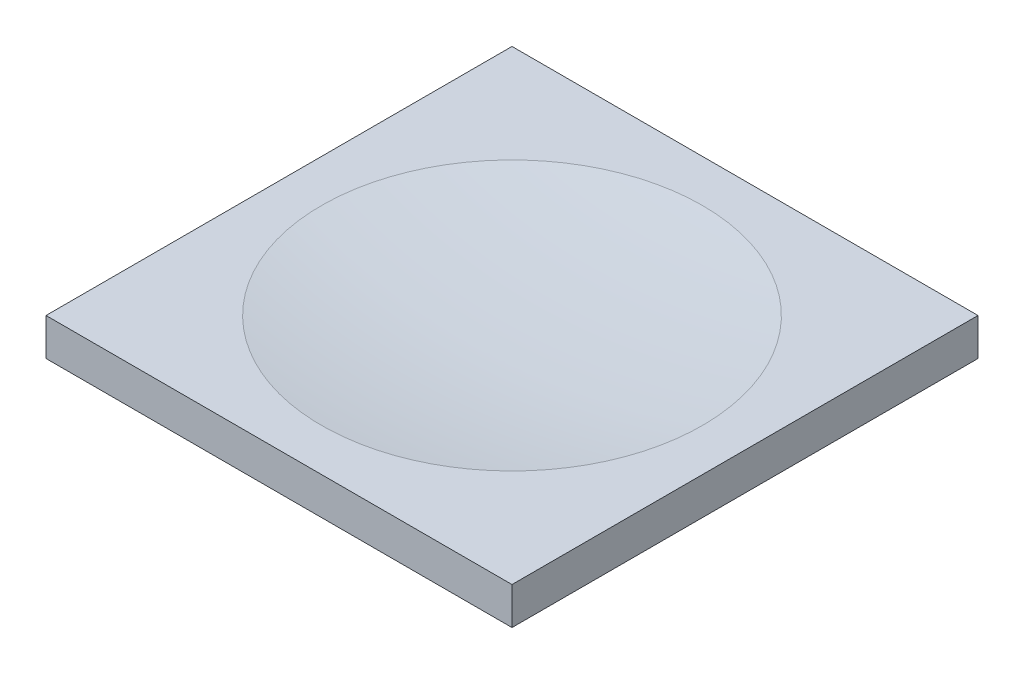
ISO-10303-21;
HEADER;
FILE_DESCRIPTION(('STEP AP214'),'2;1');
FILE_NAME('part.step','',(''),(''),'','','');
FILE_SCHEMA(('AUTOMOTIVE_DESIGN { 1 0 10303 214 1 1 1 1 }'));
ENDSEC;
DATA;
#1=APPLICATION_CONTEXT('core data for automotive mechanical design processes');
#2=APPLICATION_PROTOCOL_DEFINITION('international standard','automotive_design',2000,#1);
#3=PRODUCT_CONTEXT('',#1,'mechanical');
#4=PRODUCT('Part','Part','',(#3));
#5=PRODUCT_RELATED_PRODUCT_CATEGORY('part','',(#4));
#6=PRODUCT_DEFINITION_FORMATION('','',#4);
#7=PRODUCT_DEFINITION_CONTEXT('part definition',#1,'design');
#8=PRODUCT_DEFINITION('design','',#6,#7);
#9=PRODUCT_DEFINITION_SHAPE('','',#8);
#10=(LENGTH_UNIT() NAMED_UNIT(*) SI_UNIT(.MILLI.,.METRE.));
#11=(NAMED_UNIT(*) PLANE_ANGLE_UNIT() SI_UNIT($,.RADIAN.));
#12=(NAMED_UNIT(*) SI_UNIT($,.STERADIAN.) SOLID_ANGLE_UNIT());
#13=UNCERTAINTY_MEASURE_WITH_UNIT(LENGTH_MEASURE(1.E-05),#10,'distance_accuracy_value','');
#14=(GEOMETRIC_REPRESENTATION_CONTEXT(3) GLOBAL_UNCERTAINTY_ASSIGNED_CONTEXT((#13)) GLOBAL_UNIT_ASSIGNED_CONTEXT((#10,
#11,#12)) REPRESENTATION_CONTEXT('',''));
#15=CARTESIAN_POINT('',(0.,0.,0.));
#16=DIRECTION('',(0.,0.,1.));
#17=DIRECTION('',(1.,0.,0.));
#18=AXIS2_PLACEMENT_3D('',#15,#16,#17);
#19=CARTESIAN_POINT('',(0.,0.,0.));
#20=DIRECTION('',(0.,1.,0.));
#21=DIRECTION('',(0.,0.,1.));
#22=AXIS2_PLACEMENT_3D('',#19,#20,#21);
#23=PLANE('',#22);
#24=DIRECTION('',(-1.,0.,0.));
#25=VECTOR('',#24,1.);
#26=CARTESIAN_POINT('',(45.44,0.,25.));
#27=LINE('',#26,#25);
#28=CARTESIAN_POINT('',(45.44,0.,25.));
#29=VERTEX_POINT('',#28);
#30=CARTESIAN_POINT('',(-4.56,0.,25.));
#31=VERTEX_POINT('',#30);
#32=EDGE_CURVE('E124',#29,#31,#27,.T.);
#33=ORIENTED_EDGE('',*,*,#32,.T.);
#34=DIRECTION('',(0.,0.,-1.));
#35=VECTOR('',#34,1.);
#36=CARTESIAN_POINT('',(-4.56,0.,25.));
#37=LINE('',#36,#35);
#38=CARTESIAN_POINT('',(-4.56,0.,-25.));
#39=VERTEX_POINT('',#38);
#40=EDGE_CURVE('E127',#31,#39,#37,.T.);
#41=ORIENTED_EDGE('',*,*,#40,.T.);
#42=DIRECTION('',(1.,0.,0.));
#43=VECTOR('',#42,1.);
#44=CARTESIAN_POINT('',(-4.56,0.,-25.));
#45=LINE('',#44,#43);
#46=CARTESIAN_POINT('',(45.44,0.,-25.));
#47=VERTEX_POINT('',#46);
#48=EDGE_CURVE('E108',#39,#47,#45,.T.);
#49=ORIENTED_EDGE('',*,*,#48,.T.);
#50=DIRECTION('',(0.,0.,1.));
#51=VECTOR('',#50,1.);
#52=CARTESIAN_POINT('',(45.44,0.,-25.));
#53=LINE('',#52,#51);
#54=EDGE_CURVE('E120',#47,#29,#53,.T.);
#55=ORIENTED_EDGE('',*,*,#54,.T.);
#56=EDGE_LOOP('',(#33,#41,#49,#55));
#57=FACE_BOUND('',#56,.T.);
#58=ADVANCED_FACE('F54',(#57),#23,.F.);
#59=CARTESIAN_POINT('',(45.44,4.,25.));
#60=DIRECTION('',(0.,0.,1.));
#61=DIRECTION('',(1.,0.,0.));
#62=AXIS2_PLACEMENT_3D('',#59,#60,#61);
#63=PLANE('',#62);
#64=ORIENTED_EDGE('',*,*,#32,.F.);
#65=DIRECTION('',(0.,-1.,0.));
#66=VECTOR('',#65,1.);
#67=CARTESIAN_POINT('',(45.44,4.,25.));
#68=LINE('',#67,#66);
#69=CARTESIAN_POINT('',(45.44,4.,25.));
#70=VERTEX_POINT('',#69);
#71=EDGE_CURVE('E61',#70,#29,#68,.T.);
#72=ORIENTED_EDGE('',*,*,#71,.F.);
#73=DIRECTION('',(-1.,0.,0.));
#74=VECTOR('',#73,1.);
#75=CARTESIAN_POINT('',(45.44,4.,25.));
#76=LINE('',#75,#74);
#77=CARTESIAN_POINT('',(-4.56,4.,25.));
#78=VERTEX_POINT('',#77);
#79=EDGE_CURVE('E118',#70,#78,#76,.T.);
#80=ORIENTED_EDGE('',*,*,#79,.T.);
#81=DIRECTION('',(0.,-1.,0.));
#82=VECTOR('',#81,1.);
#83=CARTESIAN_POINT('',(-4.56,4.,25.));
#84=LINE('',#83,#82);
#85=EDGE_CURVE('E96',#78,#31,#84,.T.);
#86=ORIENTED_EDGE('',*,*,#85,.T.);
#87=EDGE_LOOP('',(#64,#72,#80,#86));
#88=FACE_BOUND('',#87,.T.);
#89=ADVANCED_FACE('F133',(#88),#63,.T.);
#90=CARTESIAN_POINT('',(45.44,4.,-25.));
#91=DIRECTION('',(1.,0.,0.));
#92=DIRECTION('',(0.,0.,-1.));
#93=AXIS2_PLACEMENT_3D('',#90,#91,#92);
#94=PLANE('',#93);
#95=ORIENTED_EDGE('',*,*,#54,.F.);
#96=DIRECTION('',(0.,-1.,0.));
#97=VECTOR('',#96,1.);
#98=CARTESIAN_POINT('',(45.44,4.,-25.));
#99=LINE('',#98,#97);
#100=CARTESIAN_POINT('',(45.44,4.,-25.));
#101=VERTEX_POINT('',#100);
#102=EDGE_CURVE('E110',#101,#47,#99,.T.);
#103=ORIENTED_EDGE('',*,*,#102,.F.);
#104=DIRECTION('',(0.,0.,1.));
#105=VECTOR('',#104,1.);
#106=CARTESIAN_POINT('',(45.44,4.,-25.));
#107=LINE('',#106,#105);
#108=EDGE_CURVE('E115',#101,#70,#107,.T.);
#109=ORIENTED_EDGE('',*,*,#108,.T.);
#110=ORIENTED_EDGE('',*,*,#71,.T.);
#111=EDGE_LOOP('',(#95,#103,#109,#110));
#112=FACE_BOUND('',#111,.T.);
#113=ADVANCED_FACE('F135',(#112),#94,.T.);
#114=CARTESIAN_POINT('',(-4.56,4.,-25.));
#115=DIRECTION('',(0.,0.,-1.));
#116=DIRECTION('',(-1.,0.,0.));
#117=AXIS2_PLACEMENT_3D('',#114,#115,#116);
#118=PLANE('',#117);
#119=ORIENTED_EDGE('',*,*,#48,.F.);
#120=DIRECTION('',(0.,-1.,0.));
#121=VECTOR('',#120,1.);
#122=CARTESIAN_POINT('',(-4.56,4.,-25.));
#123=LINE('',#122,#121);
#124=CARTESIAN_POINT('',(-4.56,4.,-25.));
#125=VERTEX_POINT('',#124);
#126=EDGE_CURVE('E102',#125,#39,#123,.T.);
#127=ORIENTED_EDGE('',*,*,#126,.F.);
#128=DIRECTION('',(1.,0.,0.));
#129=VECTOR('',#128,1.);
#130=CARTESIAN_POINT('',(-4.56,4.,-25.));
#131=LINE('',#130,#129);
#132=EDGE_CURVE('E105',#125,#101,#131,.T.);
#133=ORIENTED_EDGE('',*,*,#132,.T.);
#134=ORIENTED_EDGE('',*,*,#102,.T.);
#135=EDGE_LOOP('',(#119,#127,#133,#134));
#136=FACE_BOUND('',#135,.T.);
#137=ADVANCED_FACE('F104',(#136),#118,.T.);
#138=CARTESIAN_POINT('',(-4.56,4.,25.));
#139=DIRECTION('',(-1.,0.,0.));
#140=DIRECTION('',(0.,0.,1.));
#141=AXIS2_PLACEMENT_3D('',#138,#139,#140);
#142=PLANE('',#141);
#143=ORIENTED_EDGE('',*,*,#40,.F.);
#144=ORIENTED_EDGE('',*,*,#85,.F.);
#145=DIRECTION('',(0.,0.,-1.));
#146=VECTOR('',#145,1.);
#147=CARTESIAN_POINT('',(-4.56,4.,25.));
#148=LINE('',#147,#146);
#149=EDGE_CURVE('E114',#78,#125,#148,.T.);
#150=ORIENTED_EDGE('',*,*,#149,.T.);
#151=ORIENTED_EDGE('',*,*,#126,.T.);
#152=EDGE_LOOP('',(#143,#144,#150,#151));
#153=FACE_BOUND('',#152,.T.);
#154=ADVANCED_FACE('F117',(#153),#142,.T.);
#155=CARTESIAN_POINT('',(0.,4.,0.));
#156=DIRECTION('',(0.,-1.,0.));
#157=DIRECTION('',(0.,0.,-1.));
#158=AXIS2_PLACEMENT_3D('',#155,#156,#157);
#159=PLANE('',#158);
#160=CARTESIAN_POINT('',(20.44,4.00000000000003,0.));
#161=DIRECTION('',(0.,-1.,0.));
#162=DIRECTION('',(0.,0.,-1.));
#163=AXIS2_PLACEMENT_3D('',#160,#161,#162);
#164=CIRCLE('',#163,20.4400000000001);
#165=CARTESIAN_POINT('',(20.44,4.00000000000003,-20.4400000000001));
#166=VERTEX_POINT('',#165);
#167=EDGE_CURVE('E12',#166,#166,#164,.T.);
#168=ORIENTED_EDGE('',*,*,#167,.T.);
#169=EDGE_LOOP('',(#168));
#170=FACE_BOUND('',#169,.T.);
#171=ORIENTED_EDGE('',*,*,#79,.F.);
#172=ORIENTED_EDGE('',*,*,#108,.F.);
#173=ORIENTED_EDGE('',*,*,#132,.F.);
#174=ORIENTED_EDGE('',*,*,#149,.F.);
#175=EDGE_LOOP('',(#171,#172,#173,#174));
#176=FACE_BOUND('',#175,.T.);
#177=ADVANCED_FACE('F113',(#170,#176),#159,.F.);
#178=CARTESIAN_POINT('',(20.44,142.500332993282,-0.00104209931881677));
#179=DIRECTION('',(-1.,0.,0.));
#180=DIRECTION('',(0.,0.,-1.));
#181=AXIS2_PLACEMENT_3D('',#178,#179,#180);
#182=CIRCLE('',#181,140.000332997161);
#183=TRIMMED_CURVE('',#182,(PARAMETER_VALUE(-1.57080377034375)),
(PARAMETER_VALUE(1.57080377034375)),.T.,.PARAMETER.);
#184=CARTESIAN_POINT('',(20.44,142.500332993282,0.));
#185=DIRECTION('',(0.,-1.,0.));
#186=AXIS1_PLACEMENT('',#184,#185);
#187=SURFACE_OF_REVOLUTION('',#183,#186);
#188=ORIENTED_EDGE('',*,*,#167,.F.);
#189=EDGE_LOOP('',(#188));
#190=FACE_BOUND('',#189,.T.);
#191=CARTESIAN_POINT('',(20.44,2.5,0.));
#192=VERTEX_POINT('',#191);
#193=VERTEX_LOOP('',#192);
#194=FACE_BOUND('',#193,.T.);
#195=ADVANCED_FACE('F154',(#190,#194),#187,.F.);
#196=CLOSED_SHELL('',(#58,#89,#113,#137,#154,#177,#195));
#197=MANIFOLD_SOLID_BREP('B2',#196);
#198=ADVANCED_BREP_SHAPE_REPRESENTATION('',(#18,#197),#14);
#199=SHAPE_DEFINITION_REPRESENTATION(#9,#198);
ENDSEC;
END-ISO-10303-21;
